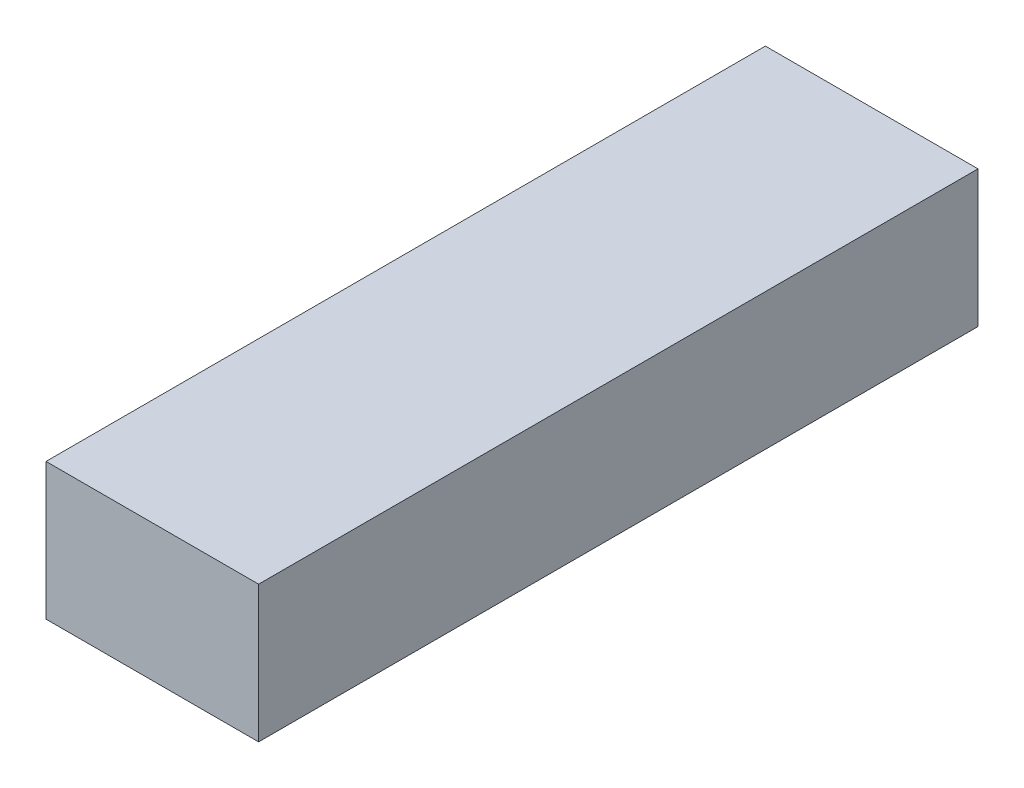
ISO-10303-21;
HEADER;
FILE_DESCRIPTION(('STEP AP214'),'2;1');
FILE_NAME('part.step','',(''),(''),'','','');
FILE_SCHEMA(('AUTOMOTIVE_DESIGN { 1 0 10303 214 1 1 1 1 }'));
ENDSEC;
DATA;
#1=APPLICATION_CONTEXT('core data for automotive mechanical design processes');
#2=APPLICATION_PROTOCOL_DEFINITION('international standard','automotive_design',2000,#1);
#3=PRODUCT_CONTEXT('',#1,'mechanical');
#4=PRODUCT('Part','Part','',(#3));
#5=PRODUCT_RELATED_PRODUCT_CATEGORY('part','',(#4));
#6=PRODUCT_DEFINITION_FORMATION('','',#4);
#7=PRODUCT_DEFINITION_CONTEXT('part definition',#1,'design');
#8=PRODUCT_DEFINITION('design','',#6,#7);
#9=PRODUCT_DEFINITION_SHAPE('','',#8);
#10=(LENGTH_UNIT() NAMED_UNIT(*) SI_UNIT(.MILLI.,.METRE.));
#11=(NAMED_UNIT(*) PLANE_ANGLE_UNIT() SI_UNIT($,.RADIAN.));
#12=(NAMED_UNIT(*) SI_UNIT($,.STERADIAN.) SOLID_ANGLE_UNIT());
#13=UNCERTAINTY_MEASURE_WITH_UNIT(LENGTH_MEASURE(1.E-05),#10,'distance_accuracy_value','');
#14=(GEOMETRIC_REPRESENTATION_CONTEXT(3) GLOBAL_UNCERTAINTY_ASSIGNED_CONTEXT((#13)) GLOBAL_UNIT_ASSIGNED_CONTEXT((#10,
#11,#12)) REPRESENTATION_CONTEXT('',''));
#15=CARTESIAN_POINT('',(0.,0.,0.));
#16=DIRECTION('',(0.,0.,1.));
#17=DIRECTION('',(1.,0.,0.));
#18=AXIS2_PLACEMENT_3D('',#15,#16,#17);
#19=CARTESIAN_POINT('',(24.511,15.748,165.862));
#20=DIRECTION('',(-1.,0.,0.));
#21=DIRECTION('',(0.,0.,1.));
#22=AXIS2_PLACEMENT_3D('',#19,#20,#21);
#23=PLANE('',#22);
#24=DIRECTION('',(0.,1.,0.));
#25=VECTOR('',#24,1.);
#26=CARTESIAN_POINT('',(24.511,15.748,0.));
#27=LINE('',#26,#25);
#28=CARTESIAN_POINT('',(24.511,-15.748,0.));
#29=VERTEX_POINT('',#28);
#30=CARTESIAN_POINT('',(24.511,15.748,0.));
#31=VERTEX_POINT('',#30);
#32=EDGE_CURVE('E99',#29,#31,#27,.T.);
#33=ORIENTED_EDGE('',*,*,#32,.T.);
#34=DIRECTION('',(0.,0.,-1.));
#35=VECTOR('',#34,1.);
#36=CARTESIAN_POINT('',(24.511,15.748,165.862));
#37=LINE('',#36,#35);
#38=CARTESIAN_POINT('',(24.511,15.748,165.862));
#39=VERTEX_POINT('',#38);
#40=EDGE_CURVE('E11',#39,#31,#37,.T.);
#41=ORIENTED_EDGE('',*,*,#40,.F.);
#42=DIRECTION('',(0.,1.,0.));
#43=VECTOR('',#42,1.);
#44=CARTESIAN_POINT('',(24.511,15.748,165.862));
#45=LINE('',#44,#43);
#46=CARTESIAN_POINT('',(24.511,-15.748,165.862));
#47=VERTEX_POINT('',#46);
#48=EDGE_CURVE('E87',#47,#39,#45,.T.);
#49=ORIENTED_EDGE('',*,*,#48,.F.);
#50=DIRECTION('',(0.,0.,-1.));
#51=VECTOR('',#50,1.);
#52=CARTESIAN_POINT('',(24.511,-15.748,165.862));
#53=LINE('',#52,#51);
#54=EDGE_CURVE('E95',#47,#29,#53,.T.);
#55=ORIENTED_EDGE('',*,*,#54,.T.);
#56=EDGE_LOOP('',(#33,#41,#49,#55));
#57=FACE_BOUND('',#56,.T.);
#58=ADVANCED_FACE('F36',(#57),#23,.F.);
#59=CARTESIAN_POINT('',(-24.511,15.748,165.862));
#60=DIRECTION('',(0.,-1.,0.));
#61=DIRECTION('',(0.,0.,-1.));
#62=AXIS2_PLACEMENT_3D('',#59,#60,#61);
#63=PLANE('',#62);
#64=DIRECTION('',(-1.,0.,0.));
#65=VECTOR('',#64,1.);
#66=CARTESIAN_POINT('',(-24.511,15.748,0.));
#67=LINE('',#66,#65);
#68=CARTESIAN_POINT('',(-24.511,15.748,0.));
#69=VERTEX_POINT('',#68);
#70=EDGE_CURVE('E91',#31,#69,#67,.T.);
#71=ORIENTED_EDGE('',*,*,#70,.T.);
#72=DIRECTION('',(0.,0.,-1.));
#73=VECTOR('',#72,1.);
#74=CARTESIAN_POINT('',(-24.511,15.748,165.862));
#75=LINE('',#74,#73);
#76=CARTESIAN_POINT('',(-24.511,15.748,165.862));
#77=VERTEX_POINT('',#76);
#78=EDGE_CURVE('E44',#77,#69,#75,.T.);
#79=ORIENTED_EDGE('',*,*,#78,.F.);
#80=DIRECTION('',(-1.,0.,0.));
#81=VECTOR('',#80,1.);
#82=CARTESIAN_POINT('',(-24.511,15.748,165.862));
#83=LINE('',#82,#81);
#84=EDGE_CURVE('E82',#39,#77,#83,.T.);
#85=ORIENTED_EDGE('',*,*,#84,.F.);
#86=ORIENTED_EDGE('',*,*,#40,.T.);
#87=EDGE_LOOP('',(#71,#79,#85,#86));
#88=FACE_BOUND('',#87,.T.);
#89=ADVANCED_FACE('F90',(#88),#63,.F.);
#90=CARTESIAN_POINT('',(-24.511,15.748,165.862));
#91=DIRECTION('',(1.,0.,0.));
#92=DIRECTION('',(0.,0.,-1.));
#93=AXIS2_PLACEMENT_3D('',#90,#91,#92);
#94=PLANE('',#93);
#95=DIRECTION('',(0.,-1.,0.));
#96=VECTOR('',#95,1.);
#97=CARTESIAN_POINT('',(-24.511,15.748,0.));
#98=LINE('',#97,#96);
#99=CARTESIAN_POINT('',(-24.511,-15.748,0.));
#100=VERTEX_POINT('',#99);
#101=EDGE_CURVE('E69',#69,#100,#98,.T.);
#102=ORIENTED_EDGE('',*,*,#101,.T.);
#103=DIRECTION('',(0.,0.,-1.));
#104=VECTOR('',#103,1.);
#105=CARTESIAN_POINT('',(-24.511,-15.748,165.862));
#106=LINE('',#105,#104);
#107=CARTESIAN_POINT('',(-24.511,-15.748,165.862));
#108=VERTEX_POINT('',#107);
#109=EDGE_CURVE('E92',#108,#100,#106,.T.);
#110=ORIENTED_EDGE('',*,*,#109,.F.);
#111=DIRECTION('',(0.,-1.,0.));
#112=VECTOR('',#111,1.);
#113=CARTESIAN_POINT('',(-24.511,15.748,165.862));
#114=LINE('',#113,#112);
#115=EDGE_CURVE('E85',#77,#108,#114,.T.);
#116=ORIENTED_EDGE('',*,*,#115,.F.);
#117=ORIENTED_EDGE('',*,*,#78,.T.);
#118=EDGE_LOOP('',(#102,#110,#116,#117));
#119=FACE_BOUND('',#118,.T.);
#120=ADVANCED_FACE('F93',(#119),#94,.F.);
#121=CARTESIAN_POINT('',(-24.511,-15.748,165.862));
#122=DIRECTION('',(0.,1.,0.));
#123=DIRECTION('',(0.,0.,1.));
#124=AXIS2_PLACEMENT_3D('',#121,#122,#123);
#125=PLANE('',#124);
#126=DIRECTION('',(1.,0.,0.));
#127=VECTOR('',#126,1.);
#128=CARTESIAN_POINT('',(-24.511,-15.748,0.));
#129=LINE('',#128,#127);
#130=EDGE_CURVE('E75',#100,#29,#129,.T.);
#131=ORIENTED_EDGE('',*,*,#130,.T.);
#132=ORIENTED_EDGE('',*,*,#54,.F.);
#133=DIRECTION('',(1.,0.,0.));
#134=VECTOR('',#133,1.);
#135=CARTESIAN_POINT('',(-24.511,-15.748,165.862));
#136=LINE('',#135,#134);
#137=EDGE_CURVE('E52',#108,#47,#136,.T.);
#138=ORIENTED_EDGE('',*,*,#137,.F.);
#139=ORIENTED_EDGE('',*,*,#109,.T.);
#140=EDGE_LOOP('',(#131,#132,#138,#139));
#141=FACE_BOUND('',#140,.T.);
#142=ADVANCED_FACE('F106',(#141),#125,.F.);
#143=CARTESIAN_POINT('',(0.,0.,165.862));
#144=DIRECTION('',(0.,0.,1.));
#145=DIRECTION('',(1.,0.,0.));
#146=AXIS2_PLACEMENT_3D('',#143,#144,#145);
#147=PLANE('',#146);
#148=ORIENTED_EDGE('',*,*,#48,.T.);
#149=ORIENTED_EDGE('',*,*,#84,.T.);
#150=ORIENTED_EDGE('',*,*,#115,.T.);
#151=ORIENTED_EDGE('',*,*,#137,.T.);
#152=EDGE_LOOP('',(#148,#149,#150,#151));
#153=FACE_BOUND('',#152,.T.);
#154=ADVANCED_FACE('F83',(#153),#147,.T.);
#155=CARTESIAN_POINT('',(0.,0.,0.));
#156=DIRECTION('',(0.,0.,1.));
#157=DIRECTION('',(1.,0.,0.));
#158=AXIS2_PLACEMENT_3D('',#155,#156,#157);
#159=PLANE('',#158);
#160=ORIENTED_EDGE('',*,*,#32,.F.);
#161=ORIENTED_EDGE('',*,*,#130,.F.);
#162=ORIENTED_EDGE('',*,*,#101,.F.);
#163=ORIENTED_EDGE('',*,*,#70,.F.);
#164=EDGE_LOOP('',(#160,#161,#162,#163));
#165=FACE_BOUND('',#164,.T.);
#166=ADVANCED_FACE('F109',(#165),#159,.F.);
#167=CLOSED_SHELL('',(#58,#89,#120,#142,#154,#166));
#168=MANIFOLD_SOLID_BREP('B2',#167);
#169=ADVANCED_BREP_SHAPE_REPRESENTATION('',(#18,#168),#14);
#170=SHAPE_DEFINITION_REPRESENTATION(#9,#169);
ENDSEC;
END-ISO-10303-21;
